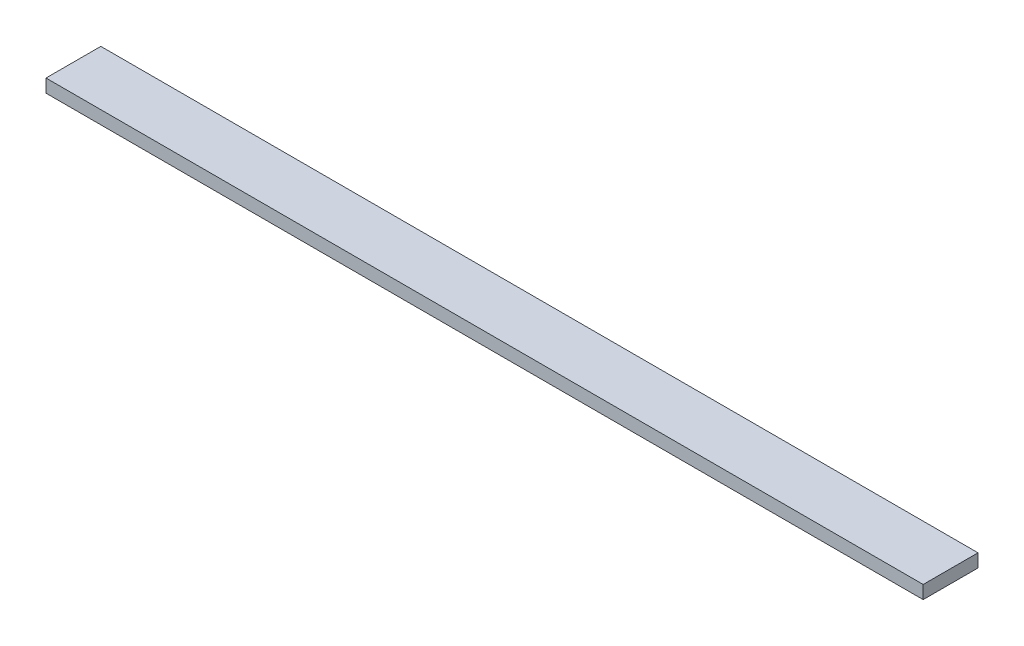
ISO-10303-21;
HEADER;
FILE_DESCRIPTION(('STEP AP214'),'2;1');
FILE_NAME('part.step','',(''),(''),'','','');
FILE_SCHEMA(('AUTOMOTIVE_DESIGN { 1 0 10303 214 1 1 1 1 }'));
ENDSEC;
DATA;
#1=APPLICATION_CONTEXT('core data for automotive mechanical design processes');
#2=APPLICATION_PROTOCOL_DEFINITION('international standard','automotive_design',2000,#1);
#3=PRODUCT_CONTEXT('',#1,'mechanical');
#4=PRODUCT('Part','Part','',(#3));
#5=PRODUCT_RELATED_PRODUCT_CATEGORY('part','',(#4));
#6=PRODUCT_DEFINITION_FORMATION('','',#4);
#7=PRODUCT_DEFINITION_CONTEXT('part definition',#1,'design');
#8=PRODUCT_DEFINITION('design','',#6,#7);
#9=PRODUCT_DEFINITION_SHAPE('','',#8);
#10=(LENGTH_UNIT() NAMED_UNIT(*) SI_UNIT(.MILLI.,.METRE.));
#11=(NAMED_UNIT(*) PLANE_ANGLE_UNIT() SI_UNIT($,.RADIAN.));
#12=(NAMED_UNIT(*) SI_UNIT($,.STERADIAN.) SOLID_ANGLE_UNIT());
#13=UNCERTAINTY_MEASURE_WITH_UNIT(LENGTH_MEASURE(1.E-05),#10,'distance_accuracy_value','');
#14=(GEOMETRIC_REPRESENTATION_CONTEXT(3) GLOBAL_UNCERTAINTY_ASSIGNED_CONTEXT((#13)) GLOBAL_UNIT_ASSIGNED_CONTEXT((#10,
#11,#12)) REPRESENTATION_CONTEXT('',''));
#15=CARTESIAN_POINT('',(0.,0.,0.));
#16=DIRECTION('',(0.,0.,1.));
#17=DIRECTION('',(1.,0.,0.));
#18=AXIS2_PLACEMENT_3D('',#15,#16,#17);
#19=CARTESIAN_POINT('',(1200.,0.,0.));
#20=DIRECTION('',(0.,0.,1.));
#21=DIRECTION('',(1.,0.,0.));
#22=AXIS2_PLACEMENT_3D('',#19,#20,#21);
#23=PLANE('',#22);
#24=DIRECTION('',(0.,1.,0.));
#25=VECTOR('',#24,1.);
#26=CARTESIAN_POINT('',(0.,0.,0.));
#27=LINE('',#26,#25);
#28=CARTESIAN_POINT('',(0.,0.,0.));
#29=VERTEX_POINT('',#28);
#30=CARTESIAN_POINT('',(0.,18.,0.));
#31=VERTEX_POINT('',#30);
#32=EDGE_CURVE('E96',#29,#31,#27,.T.);
#33=ORIENTED_EDGE('',*,*,#32,.T.);
#34=DIRECTION('',(-1.,0.,0.));
#35=VECTOR('',#34,1.);
#36=CARTESIAN_POINT('',(1200.,18.,0.));
#37=LINE('',#36,#35);
#38=CARTESIAN_POINT('',(1200.,18.,0.));
#39=VERTEX_POINT('',#38);
#40=EDGE_CURVE('E11',#39,#31,#37,.T.);
#41=ORIENTED_EDGE('',*,*,#40,.F.);
#42=DIRECTION('',(0.,1.,0.));
#43=VECTOR('',#42,1.);
#44=CARTESIAN_POINT('',(1200.,0.,0.));
#45=LINE('',#44,#43);
#46=CARTESIAN_POINT('',(1200.,0.,0.));
#47=VERTEX_POINT('',#46);
#48=EDGE_CURVE('E84',#47,#39,#45,.T.);
#49=ORIENTED_EDGE('',*,*,#48,.F.);
#50=DIRECTION('',(-1.,0.,0.));
#51=VECTOR('',#50,1.);
#52=CARTESIAN_POINT('',(1200.,0.,0.));
#53=LINE('',#52,#51);
#54=EDGE_CURVE('E92',#47,#29,#53,.T.);
#55=ORIENTED_EDGE('',*,*,#54,.T.);
#56=EDGE_LOOP('',(#33,#41,#49,#55));
#57=FACE_BOUND('',#56,.T.);
#58=ADVANCED_FACE('F33',(#57),#23,.F.);
#59=CARTESIAN_POINT('',(1200.,18.,0.));
#60=DIRECTION('',(0.,-1.,0.));
#61=DIRECTION('',(0.,0.,-1.));
#62=AXIS2_PLACEMENT_3D('',#59,#60,#61);
#63=PLANE('',#62);
#64=DIRECTION('',(0.,0.,1.));
#65=VECTOR('',#64,1.);
#66=CARTESIAN_POINT('',(0.,18.,0.));
#67=LINE('',#66,#65);
#68=CARTESIAN_POINT('',(0.,18.,75.));
#69=VERTEX_POINT('',#68);
#70=EDGE_CURVE('E88',#31,#69,#67,.T.);
#71=ORIENTED_EDGE('',*,*,#70,.T.);
#72=DIRECTION('',(-1.,0.,0.));
#73=VECTOR('',#72,1.);
#74=CARTESIAN_POINT('',(1200.,18.,75.));
#75=LINE('',#74,#73);
#76=CARTESIAN_POINT('',(1200.,18.,75.));
#77=VERTEX_POINT('',#76);
#78=EDGE_CURVE('E41',#77,#69,#75,.T.);
#79=ORIENTED_EDGE('',*,*,#78,.F.);
#80=DIRECTION('',(0.,0.,1.));
#81=VECTOR('',#80,1.);
#82=CARTESIAN_POINT('',(1200.,18.,0.));
#83=LINE('',#82,#81);
#84=EDGE_CURVE('E79',#39,#77,#83,.T.);
#85=ORIENTED_EDGE('',*,*,#84,.F.);
#86=ORIENTED_EDGE('',*,*,#40,.T.);
#87=EDGE_LOOP('',(#71,#79,#85,#86));
#88=FACE_BOUND('',#87,.T.);
#89=ADVANCED_FACE('F87',(#88),#63,.F.);
#90=CARTESIAN_POINT('',(1200.,0.,75.));
#91=DIRECTION('',(0.,0.,-1.));
#92=DIRECTION('',(-1.,0.,0.));
#93=AXIS2_PLACEMENT_3D('',#90,#91,#92);
#94=PLANE('',#93);
#95=DIRECTION('',(0.,-1.,0.));
#96=VECTOR('',#95,1.);
#97=CARTESIAN_POINT('',(0.,0.,75.));
#98=LINE('',#97,#96);
#99=CARTESIAN_POINT('',(0.,0.,75.));
#100=VERTEX_POINT('',#99);
#101=EDGE_CURVE('E66',#69,#100,#98,.T.);
#102=ORIENTED_EDGE('',*,*,#101,.T.);
#103=DIRECTION('',(-1.,0.,0.));
#104=VECTOR('',#103,1.);
#105=CARTESIAN_POINT('',(1200.,0.,75.));
#106=LINE('',#105,#104);
#107=CARTESIAN_POINT('',(1200.,0.,75.));
#108=VERTEX_POINT('',#107);
#109=EDGE_CURVE('E89',#108,#100,#106,.T.);
#110=ORIENTED_EDGE('',*,*,#109,.F.);
#111=DIRECTION('',(0.,-1.,0.));
#112=VECTOR('',#111,1.);
#113=CARTESIAN_POINT('',(1200.,0.,75.));
#114=LINE('',#113,#112);
#115=EDGE_CURVE('E82',#77,#108,#114,.T.);
#116=ORIENTED_EDGE('',*,*,#115,.F.);
#117=ORIENTED_EDGE('',*,*,#78,.T.);
#118=EDGE_LOOP('',(#102,#110,#116,#117));
#119=FACE_BOUND('',#118,.T.);
#120=ADVANCED_FACE('F90',(#119),#94,.F.);
#121=CARTESIAN_POINT('',(1200.,0.,0.));
#122=DIRECTION('',(0.,1.,0.));
#123=DIRECTION('',(0.,0.,1.));
#124=AXIS2_PLACEMENT_3D('',#121,#122,#123);
#125=PLANE('',#124);
#126=DIRECTION('',(0.,0.,-1.));
#127=VECTOR('',#126,1.);
#128=CARTESIAN_POINT('',(0.,0.,0.));
#129=LINE('',#128,#127);
#130=EDGE_CURVE('E72',#100,#29,#129,.T.);
#131=ORIENTED_EDGE('',*,*,#130,.T.);
#132=ORIENTED_EDGE('',*,*,#54,.F.);
#133=DIRECTION('',(0.,0.,-1.));
#134=VECTOR('',#133,1.);
#135=CARTESIAN_POINT('',(1200.,0.,0.));
#136=LINE('',#135,#134);
#137=EDGE_CURVE('E49',#108,#47,#136,.T.);
#138=ORIENTED_EDGE('',*,*,#137,.F.);
#139=ORIENTED_EDGE('',*,*,#109,.T.);
#140=EDGE_LOOP('',(#131,#132,#138,#139));
#141=FACE_BOUND('',#140,.T.);
#142=ADVANCED_FACE('F103',(#141),#125,.F.);
#143=CARTESIAN_POINT('',(1200.,18.,0.));
#144=DIRECTION('',(1.,0.,0.));
#145=DIRECTION('',(0.,0.,-1.));
#146=AXIS2_PLACEMENT_3D('',#143,#144,#145);
#147=PLANE('',#146);
#148=ORIENTED_EDGE('',*,*,#48,.T.);
#149=ORIENTED_EDGE('',*,*,#84,.T.);
#150=ORIENTED_EDGE('',*,*,#115,.T.);
#151=ORIENTED_EDGE('',*,*,#137,.T.);
#152=EDGE_LOOP('',(#148,#149,#150,#151));
#153=FACE_BOUND('',#152,.T.);
#154=ADVANCED_FACE('F80',(#153),#147,.T.);
#155=CARTESIAN_POINT('',(0.,18.,0.));
#156=DIRECTION('',(1.,0.,0.));
#157=DIRECTION('',(0.,0.,-1.));
#158=AXIS2_PLACEMENT_3D('',#155,#156,#157);
#159=PLANE('',#158);
#160=ORIENTED_EDGE('',*,*,#32,.F.);
#161=ORIENTED_EDGE('',*,*,#130,.F.);
#162=ORIENTED_EDGE('',*,*,#101,.F.);
#163=ORIENTED_EDGE('',*,*,#70,.F.);
#164=EDGE_LOOP('',(#160,#161,#162,#163));
#165=FACE_BOUND('',#164,.T.);
#166=ADVANCED_FACE('F106',(#165),#159,.F.);
#167=CLOSED_SHELL('',(#58,#89,#120,#142,#154,#166));
#168=MANIFOLD_SOLID_BREP('B2',#167);
#169=ADVANCED_BREP_SHAPE_REPRESENTATION('',(#18,#168),#14);
#170=SHAPE_DEFINITION_REPRESENTATION(#9,#169);
ENDSEC;
END-ISO-10303-21;
